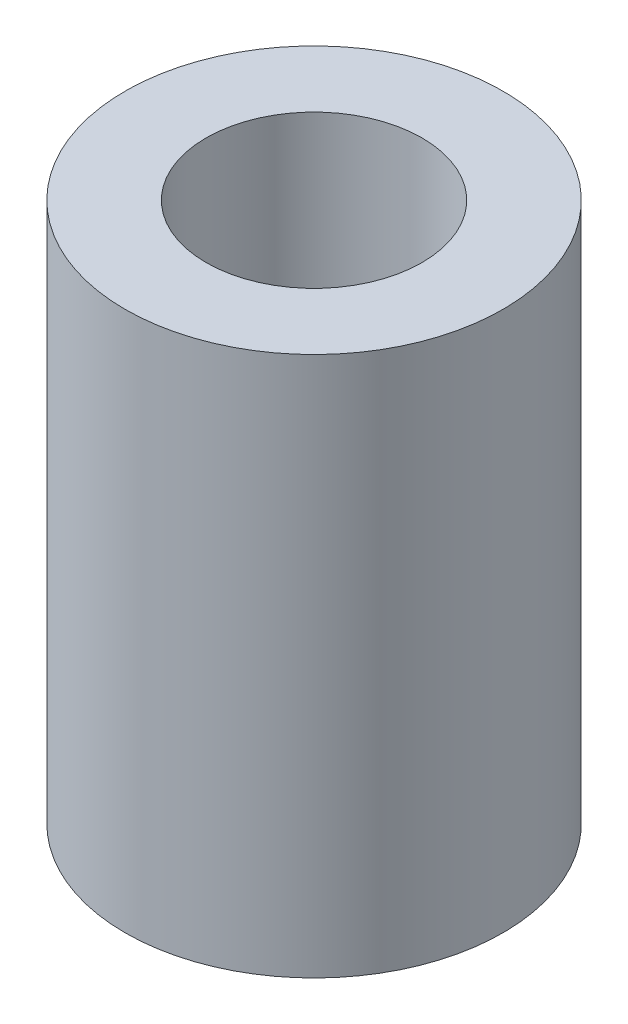
ISO-10303-21;
HEADER;
FILE_DESCRIPTION(('STEP AP214'),'2;1');
FILE_NAME('part.step','',(''),(''),'','','');
FILE_SCHEMA(('AUTOMOTIVE_DESIGN { 1 0 10303 214 1 1 1 1 }'));
ENDSEC;
DATA;
#1=APPLICATION_CONTEXT('core data for automotive mechanical design processes');
#2=APPLICATION_PROTOCOL_DEFINITION('international standard','automotive_design',2000,#1);
#3=PRODUCT_CONTEXT('',#1,'mechanical');
#4=PRODUCT('Part','Part','',(#3));
#5=PRODUCT_RELATED_PRODUCT_CATEGORY('part','',(#4));
#6=PRODUCT_DEFINITION_FORMATION('','',#4);
#7=PRODUCT_DEFINITION_CONTEXT('part definition',#1,'design');
#8=PRODUCT_DEFINITION('design','',#6,#7);
#9=PRODUCT_DEFINITION_SHAPE('','',#8);
#10=(LENGTH_UNIT() NAMED_UNIT(*) SI_UNIT(.MILLI.,.METRE.));
#11=(NAMED_UNIT(*) PLANE_ANGLE_UNIT() SI_UNIT($,.RADIAN.));
#12=(NAMED_UNIT(*) SI_UNIT($,.STERADIAN.) SOLID_ANGLE_UNIT());
#13=UNCERTAINTY_MEASURE_WITH_UNIT(LENGTH_MEASURE(1.E-05),#10,'distance_accuracy_value','');
#14=(GEOMETRIC_REPRESENTATION_CONTEXT(3) GLOBAL_UNCERTAINTY_ASSIGNED_CONTEXT((#13)) GLOBAL_UNIT_ASSIGNED_CONTEXT((#10,
#11,#12)) REPRESENTATION_CONTEXT('',''));
#15=CARTESIAN_POINT('',(0.,0.,0.));
#16=DIRECTION('',(0.,0.,1.));
#17=DIRECTION('',(1.,0.,0.));
#18=AXIS2_PLACEMENT_3D('',#15,#16,#17);
#19=CARTESIAN_POINT('',(0.,5.,0.));
#20=DIRECTION('',(0.,1.,0.));
#21=DIRECTION('',(0.,0.,1.));
#22=AXIS2_PLACEMENT_3D('',#19,#20,#21);
#23=PLANE('',#22);
#24=CARTESIAN_POINT('',(0.,5.,0.));
#25=DIRECTION('',(0.,1.,0.));
#26=DIRECTION('',(0.,0.,1.));
#27=AXIS2_PLACEMENT_3D('',#24,#25,#26);
#28=CIRCLE('',#27,1.75);
#29=CARTESIAN_POINT('',(0.,5.,1.75));
#30=VERTEX_POINT('',#29);
#31=EDGE_CURVE('E10',#30,#30,#28,.T.);
#32=ORIENTED_EDGE('',*,*,#31,.T.);
#33=EDGE_LOOP('',(#32));
#34=FACE_BOUND('',#33,.T.);
#35=CARTESIAN_POINT('',(0.,5.,0.));
#36=DIRECTION('',(0.,1.,0.));
#37=DIRECTION('',(0.,0.,1.));
#38=AXIS2_PLACEMENT_3D('',#35,#36,#37);
#39=CIRCLE('',#38,1.);
#40=CARTESIAN_POINT('',(0.,5.,1.));
#41=VERTEX_POINT('',#40);
#42=EDGE_CURVE('E54',#41,#41,#39,.T.);
#43=ORIENTED_EDGE('',*,*,#42,.F.);
#44=EDGE_LOOP('',(#43));
#45=FACE_BOUND('',#44,.T.);
#46=ADVANCED_FACE('F41',(#34,#45),#23,.T.);
#47=CARTESIAN_POINT('',(0.,0.,0.));
#48=DIRECTION('',(0.,1.,0.));
#49=DIRECTION('',(0.,0.,1.));
#50=AXIS2_PLACEMENT_3D('',#47,#48,#49);
#51=PLANE('',#50);
#52=CARTESIAN_POINT('',(0.,0.,0.));
#53=DIRECTION('',(0.,1.,0.));
#54=DIRECTION('',(0.,0.,1.));
#55=AXIS2_PLACEMENT_3D('',#52,#53,#54);
#56=CIRCLE('',#55,1.75);
#57=CARTESIAN_POINT('',(0.,0.,1.75));
#58=VERTEX_POINT('',#57);
#59=EDGE_CURVE('E45',#58,#58,#56,.T.);
#60=ORIENTED_EDGE('',*,*,#59,.F.);
#61=EDGE_LOOP('',(#60));
#62=FACE_BOUND('',#61,.T.);
#63=CARTESIAN_POINT('',(0.,0.,0.));
#64=DIRECTION('',(0.,1.,0.));
#65=DIRECTION('',(0.,0.,1.));
#66=AXIS2_PLACEMENT_3D('',#63,#64,#65);
#67=CIRCLE('',#66,1.);
#68=CARTESIAN_POINT('',(0.,0.,1.));
#69=VERTEX_POINT('',#68);
#70=EDGE_CURVE('E56',#69,#69,#67,.T.);
#71=ORIENTED_EDGE('',*,*,#70,.T.);
#72=EDGE_LOOP('',(#71));
#73=FACE_BOUND('',#72,.T.);
#74=ADVANCED_FACE('F68',(#62,#73),#51,.F.);
#75=CARTESIAN_POINT('',(0.,5.,0.));
#76=DIRECTION('',(0.,-1.,0.));
#77=DIRECTION('',(0.,0.,-1.));
#78=AXIS2_PLACEMENT_3D('',#75,#76,#77);
#79=CYLINDRICAL_SURFACE('',#78,1.75);
#80=ORIENTED_EDGE('',*,*,#31,.F.);
#81=EDGE_LOOP('',(#80));
#82=FACE_BOUND('',#81,.T.);
#83=ORIENTED_EDGE('',*,*,#59,.T.);
#84=EDGE_LOOP('',(#83));
#85=FACE_BOUND('',#84,.T.);
#86=ADVANCED_FACE('F43',(#82,#85),#79,.T.);
#87=CARTESIAN_POINT('',(0.,5.,0.));
#88=DIRECTION('',(0.,-1.,0.));
#89=DIRECTION('',(0.,0.,-1.));
#90=AXIS2_PLACEMENT_3D('',#87,#88,#89);
#91=CYLINDRICAL_SURFACE('',#90,1.);
#92=ORIENTED_EDGE('',*,*,#42,.T.);
#93=EDGE_LOOP('',(#92));
#94=FACE_BOUND('',#93,.T.);
#95=ORIENTED_EDGE('',*,*,#70,.F.);
#96=EDGE_LOOP('',(#95));
#97=FACE_BOUND('',#96,.T.);
#98=ADVANCED_FACE('F64',(#94,#97),#91,.F.);
#99=CLOSED_SHELL('',(#46,#74,#86,#98));
#100=MANIFOLD_SOLID_BREP('B2',#99);
#101=ADVANCED_BREP_SHAPE_REPRESENTATION('',(#18,#100),#14);
#102=SHAPE_DEFINITION_REPRESENTATION(#9,#101);
ENDSEC;
END-ISO-10303-21;
